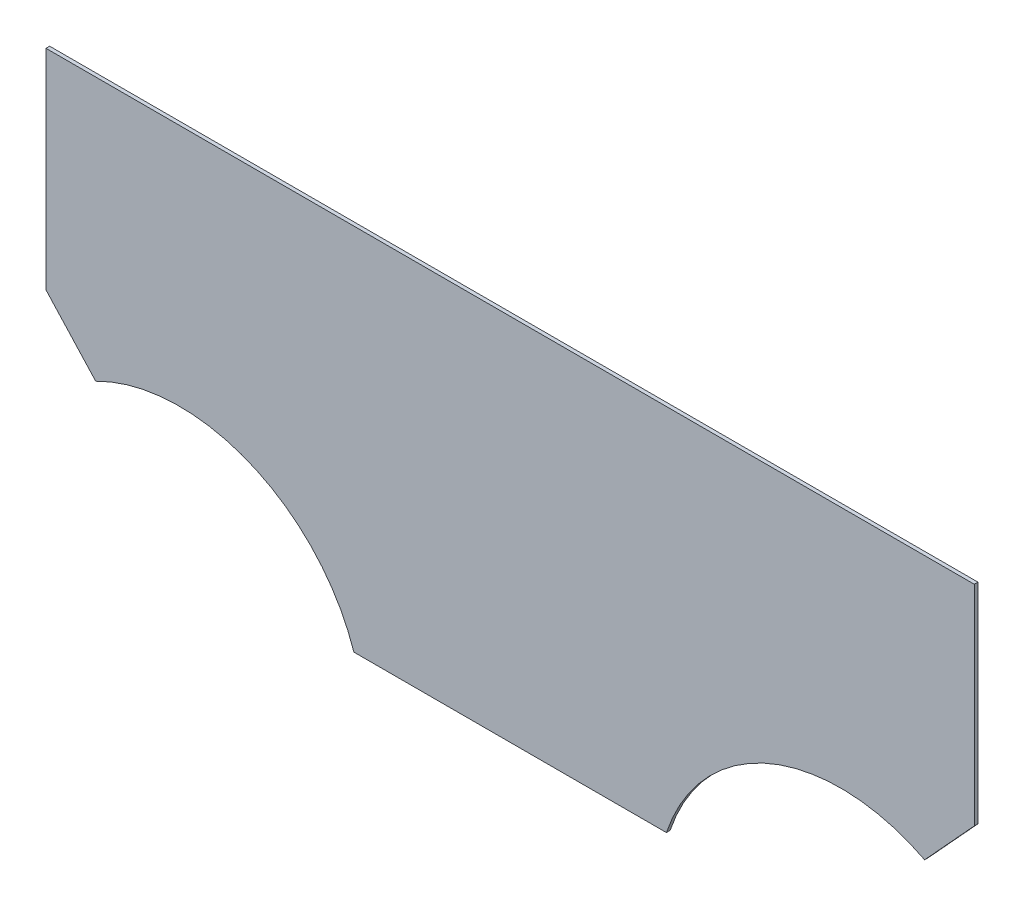
ISO-10303-21;
HEADER;
FILE_DESCRIPTION(('STEP AP214'),'2;1');
FILE_NAME('part.step','',(''),(''),'','','');
FILE_SCHEMA(('AUTOMOTIVE_DESIGN { 1 0 10303 214 1 1 1 1 }'));
ENDSEC;
DATA;
#1=APPLICATION_CONTEXT('core data for automotive mechanical design processes');
#2=APPLICATION_PROTOCOL_DEFINITION('international standard','automotive_design',2000,#1);
#3=PRODUCT_CONTEXT('',#1,'mechanical');
#4=PRODUCT('Part','Part','',(#3));
#5=PRODUCT_RELATED_PRODUCT_CATEGORY('part','',(#4));
#6=PRODUCT_DEFINITION_FORMATION('','',#4);
#7=PRODUCT_DEFINITION_CONTEXT('part definition',#1,'design');
#8=PRODUCT_DEFINITION('design','',#6,#7);
#9=PRODUCT_DEFINITION_SHAPE('','',#8);
#10=(LENGTH_UNIT() NAMED_UNIT(*) SI_UNIT(.MILLI.,.METRE.));
#11=(NAMED_UNIT(*) PLANE_ANGLE_UNIT() SI_UNIT($,.RADIAN.));
#12=(NAMED_UNIT(*) SI_UNIT($,.STERADIAN.) SOLID_ANGLE_UNIT());
#13=UNCERTAINTY_MEASURE_WITH_UNIT(LENGTH_MEASURE(1.E-05),#10,'distance_accuracy_value','');
#14=(GEOMETRIC_REPRESENTATION_CONTEXT(3) GLOBAL_UNCERTAINTY_ASSIGNED_CONTEXT((#13)) GLOBAL_UNIT_ASSIGNED_CONTEXT((#10,
#11,#12)) REPRESENTATION_CONTEXT('',''));
#15=CARTESIAN_POINT('',(0.,0.,0.));
#16=DIRECTION('',(0.,0.,1.));
#17=DIRECTION('',(1.,0.,0.));
#18=AXIS2_PLACEMENT_3D('',#15,#16,#17);
#19=CARTESIAN_POINT('',(72.0080953626778,-182.32146969061,2.));
#20=DIRECTION('',(0.,0.,-1.));
#21=DIRECTION('',(-1.,0.,0.));
#22=AXIS2_PLACEMENT_3D('',#19,#20,#21);
#23=CYLINDRICAL_SURFACE('',#22,100.);
#24=CARTESIAN_POINT('',(72.0080953626778,-182.32146969061,0.));
#25=DIRECTION('',(0.,0.,1.));
#26=DIRECTION('',(1.,0.,0.));
#27=AXIS2_PLACEMENT_3D('',#24,#25,#26);
#28=CIRCLE('',#27,100.);
#29=CARTESIAN_POINT('',(166.886244338372,-150.728165859799,0.));
#30=VERTEX_POINT('',#29);
#31=CARTESIAN_POINT('',(26.4126061623032,-93.3211811260303,0.));
#32=VERTEX_POINT('',#31);
#33=EDGE_CURVE('E133',#30,#32,#28,.T.);
#34=ORIENTED_EDGE('',*,*,#33,.F.);
#35=DIRECTION('',(0.,0.,-1.));
#36=VECTOR('',#35,1.);
#37=CARTESIAN_POINT('',(166.886244338372,-150.728165859799,2.));
#38=LINE('',#37,#36);
#39=CARTESIAN_POINT('',(166.886244338372,-150.728165859799,2.));
#40=VERTEX_POINT('',#39);
#41=EDGE_CURVE('E11',#40,#30,#38,.T.);
#42=ORIENTED_EDGE('',*,*,#41,.F.);
#43=CARTESIAN_POINT('',(72.0080953626778,-182.32146969061,2.));
#44=DIRECTION('',(0.,0.,1.));
#45=DIRECTION('',(1.,0.,0.));
#46=AXIS2_PLACEMENT_3D('',#43,#44,#45);
#47=CIRCLE('',#46,100.);
#48=CARTESIAN_POINT('',(26.4126061623032,-93.3211811260303,2.));
#49=VERTEX_POINT('',#48);
#50=EDGE_CURVE('E153',#40,#49,#47,.T.);
#51=ORIENTED_EDGE('',*,*,#50,.T.);
#52=DIRECTION('',(0.,0.,-1.));
#53=VECTOR('',#52,1.);
#54=CARTESIAN_POINT('',(26.4126061623032,-93.3211811260303,2.));
#55=LINE('',#54,#53);
#56=EDGE_CURVE('E39',#49,#32,#55,.T.);
#57=ORIENTED_EDGE('',*,*,#56,.T.);
#58=EDGE_LOOP('',(#34,#42,#51,#57));
#59=FACE_BOUND('',#58,.T.);
#60=ADVANCED_FACE('F36',(#59),#23,.F.);
#61=CARTESIAN_POINT('',(336.886244338372,-150.728165859799,2.));
#62=DIRECTION('',(0.,-1.,0.));
#63=DIRECTION('',(0.,0.,-1.));
#64=AXIS2_PLACEMENT_3D('',#61,#62,#63);
#65=PLANE('',#64);
#66=DIRECTION('',(-1.,0.,0.));
#67=VECTOR('',#66,1.);
#68=CARTESIAN_POINT('',(336.886244338372,-150.728165859799,0.));
#69=LINE('',#68,#67);
#70=CARTESIAN_POINT('',(336.886244338372,-150.728165859799,0.));
#71=VERTEX_POINT('',#70);
#72=EDGE_CURVE('E151',#71,#30,#69,.T.);
#73=ORIENTED_EDGE('',*,*,#72,.F.);
#74=DIRECTION('',(0.,0.,-1.));
#75=VECTOR('',#74,1.);
#76=CARTESIAN_POINT('',(336.886244338372,-150.728165859799,2.));
#77=LINE('',#76,#75);
#78=CARTESIAN_POINT('',(336.886244338372,-150.728165859799,2.));
#79=VERTEX_POINT('',#78);
#80=EDGE_CURVE('E45',#79,#71,#77,.T.);
#81=ORIENTED_EDGE('',*,*,#80,.F.);
#82=DIRECTION('',(-1.,0.,0.));
#83=VECTOR('',#82,1.);
#84=CARTESIAN_POINT('',(336.886244338372,-150.728165859799,2.));
#85=LINE('',#84,#83);
#86=EDGE_CURVE('E123',#79,#40,#85,.T.);
#87=ORIENTED_EDGE('',*,*,#86,.T.);
#88=ORIENTED_EDGE('',*,*,#41,.T.);
#89=EDGE_LOOP('',(#73,#81,#87,#88));
#90=FACE_BOUND('',#89,.T.);
#91=ADVANCED_FACE('F165',(#90),#65,.T.);
#92=CARTESIAN_POINT('',(431.764393314067,-182.32146969061,2.));
#93=DIRECTION('',(0.,0.,-1.));
#94=DIRECTION('',(-1.,0.,0.));
#95=AXIS2_PLACEMENT_3D('',#92,#93,#94);
#96=CYLINDRICAL_SURFACE('',#95,100.);
#97=CARTESIAN_POINT('',(431.764393314067,-182.32146969061,0.));
#98=DIRECTION('',(0.,0.,1.));
#99=DIRECTION('',(1.,0.,0.));
#100=AXIS2_PLACEMENT_3D('',#97,#98,#99);
#101=CIRCLE('',#100,100.);
#102=CARTESIAN_POINT('',(477.359882514441,-93.3211811260303,0.));
#103=VERTEX_POINT('',#102);
#104=EDGE_CURVE('E110',#103,#71,#101,.T.);
#105=ORIENTED_EDGE('',*,*,#104,.F.);
#106=DIRECTION('',(0.,0.,-1.));
#107=VECTOR('',#106,1.);
#108=CARTESIAN_POINT('',(477.359882514441,-93.3211811260303,2.));
#109=LINE('',#108,#107);
#110=CARTESIAN_POINT('',(477.359882514441,-93.3211811260303,2.));
#111=VERTEX_POINT('',#110);
#112=EDGE_CURVE('E105',#111,#103,#109,.T.);
#113=ORIENTED_EDGE('',*,*,#112,.F.);
#114=CARTESIAN_POINT('',(431.764393314067,-182.32146969061,2.));
#115=DIRECTION('',(0.,0.,1.));
#116=DIRECTION('',(1.,0.,0.));
#117=AXIS2_PLACEMENT_3D('',#114,#115,#116);
#118=CIRCLE('',#117,100.);
#119=EDGE_CURVE('E108',#111,#79,#118,.T.);
#120=ORIENTED_EDGE('',*,*,#119,.T.);
#121=ORIENTED_EDGE('',*,*,#80,.T.);
#122=EDGE_LOOP('',(#105,#113,#120,#121));
#123=FACE_BOUND('',#122,.T.);
#124=ADVANCED_FACE('F107',(#123),#96,.F.);
#125=CARTESIAN_POINT('',(504.386244338372,-63.8326110257021,2.));
#126=DIRECTION('',(0.737214252508203,-0.675659045598274,0.));
#127=DIRECTION('',(0.675659045598274,0.737214252508203,0.));
#128=AXIS2_PLACEMENT_3D('',#125,#126,#127);
#129=PLANE('',#128);
#130=DIRECTION('',(-0.675659045598274,-0.737214252508203,0.));
#131=VECTOR('',#130,1.);
#132=CARTESIAN_POINT('',(504.386244338372,-63.8326110257021,0.));
#133=LINE('',#132,#131);
#134=CARTESIAN_POINT('',(504.386244338372,-63.8326110257021,0.));
#135=VERTEX_POINT('',#134);
#136=EDGE_CURVE('E148',#135,#103,#133,.T.);
#137=ORIENTED_EDGE('',*,*,#136,.F.);
#138=DIRECTION('',(0.,0.,-1.));
#139=VECTOR('',#138,1.);
#140=CARTESIAN_POINT('',(504.386244338372,-63.8326110257021,2.));
#141=LINE('',#140,#139);
#142=CARTESIAN_POINT('',(504.386244338372,-63.8326110257021,2.));
#143=VERTEX_POINT('',#142);
#144=EDGE_CURVE('E115',#143,#135,#141,.T.);
#145=ORIENTED_EDGE('',*,*,#144,.F.);
#146=DIRECTION('',(-0.675659045598274,-0.737214252508203,0.));
#147=VECTOR('',#146,1.);
#148=CARTESIAN_POINT('',(504.386244338372,-63.8326110257021,2.));
#149=LINE('',#148,#147);
#150=EDGE_CURVE('E121',#143,#111,#149,.T.);
#151=ORIENTED_EDGE('',*,*,#150,.T.);
#152=ORIENTED_EDGE('',*,*,#112,.T.);
#153=EDGE_LOOP('',(#137,#145,#151,#152));
#154=FACE_BOUND('',#153,.T.);
#155=ADVANCED_FACE('F125',(#154),#129,.T.);
#156=CARTESIAN_POINT('',(504.386244338372,50.0000000000001,2.));
#157=DIRECTION('',(1.,0.,0.));
#158=DIRECTION('',(0.,0.,-1.));
#159=AXIS2_PLACEMENT_3D('',#156,#157,#158);
#160=PLANE('',#159);
#161=DIRECTION('',(0.,-1.,0.));
#162=VECTOR('',#161,1.);
#163=CARTESIAN_POINT('',(504.386244338372,50.0000000000001,0.));
#164=LINE('',#163,#162);
#165=CARTESIAN_POINT('',(504.386244338372,50.0000000000001,0.));
#166=VERTEX_POINT('',#165);
#167=EDGE_CURVE('E145',#166,#135,#164,.T.);
#168=ORIENTED_EDGE('',*,*,#167,.F.);
#169=DIRECTION('',(0.,0.,-1.));
#170=VECTOR('',#169,1.);
#171=CARTESIAN_POINT('',(504.386244338372,50.0000000000001,2.));
#172=LINE('',#171,#170);
#173=CARTESIAN_POINT('',(504.386244338372,50.0000000000001,2.));
#174=VERTEX_POINT('',#173);
#175=EDGE_CURVE('E157',#174,#166,#172,.T.);
#176=ORIENTED_EDGE('',*,*,#175,.F.);
#177=DIRECTION('',(0.,-1.,0.));
#178=VECTOR('',#177,1.);
#179=CARTESIAN_POINT('',(504.386244338372,50.0000000000001,2.));
#180=LINE('',#179,#178);
#181=EDGE_CURVE('E126',#174,#143,#180,.T.);
#182=ORIENTED_EDGE('',*,*,#181,.T.);
#183=ORIENTED_EDGE('',*,*,#144,.T.);
#184=EDGE_LOOP('',(#168,#176,#182,#183));
#185=FACE_BOUND('',#184,.T.);
#186=ADVANCED_FACE('F178',(#185),#160,.T.);
#187=CARTESIAN_POINT('',(-0.613755661627802,50.0000000000001,2.));
#188=DIRECTION('',(0.,1.,0.));
#189=DIRECTION('',(-1.,0.,0.));
#190=AXIS2_PLACEMENT_3D('',#187,#188,#189);
#191=PLANE('',#190);
#192=DIRECTION('',(1.,0.,0.));
#193=VECTOR('',#192,1.);
#194=CARTESIAN_POINT('',(-0.613755661627802,50.0000000000001,0.));
#195=LINE('',#194,#193);
#196=CARTESIAN_POINT('',(-0.613755661627802,50.0000000000001,0.));
#197=VERTEX_POINT('',#196);
#198=EDGE_CURVE('E142',#197,#166,#195,.T.);
#199=ORIENTED_EDGE('',*,*,#198,.F.);
#200=DIRECTION('',(0.,0.,-1.));
#201=VECTOR('',#200,1.);
#202=CARTESIAN_POINT('',(-0.613755661627802,50.0000000000001,2.));
#203=LINE('',#202,#201);
#204=CARTESIAN_POINT('',(-0.613755661627802,50.0000000000001,2.));
#205=VERTEX_POINT('',#204);
#206=EDGE_CURVE('E159',#205,#197,#203,.T.);
#207=ORIENTED_EDGE('',*,*,#206,.F.);
#208=DIRECTION('',(1.,0.,0.));
#209=VECTOR('',#208,1.);
#210=CARTESIAN_POINT('',(-0.613755661627802,50.0000000000001,2.));
#211=LINE('',#210,#209);
#212=EDGE_CURVE('E128',#205,#174,#211,.T.);
#213=ORIENTED_EDGE('',*,*,#212,.T.);
#214=ORIENTED_EDGE('',*,*,#175,.T.);
#215=EDGE_LOOP('',(#199,#207,#213,#214));
#216=FACE_BOUND('',#215,.T.);
#217=ADVANCED_FACE('F181',(#216),#191,.T.);
#218=CARTESIAN_POINT('',(-0.613755661627802,-63.8326110257022,2.));
#219=DIRECTION('',(-1.,0.,0.));
#220=DIRECTION('',(0.,0.,1.));
#221=AXIS2_PLACEMENT_3D('',#218,#219,#220);
#222=PLANE('',#221);
#223=DIRECTION('',(0.,1.,0.));
#224=VECTOR('',#223,1.);
#225=CARTESIAN_POINT('',(-0.613755661627802,-63.8326110257022,0.));
#226=LINE('',#225,#224);
#227=CARTESIAN_POINT('',(-0.613755661627802,-63.8326110257022,0.));
#228=VERTEX_POINT('',#227);
#229=EDGE_CURVE('E139',#228,#197,#226,.T.);
#230=ORIENTED_EDGE('',*,*,#229,.F.);
#231=DIRECTION('',(0.,0.,-1.));
#232=VECTOR('',#231,1.);
#233=CARTESIAN_POINT('',(-0.613755661627802,-63.8326110257022,2.));
#234=LINE('',#233,#232);
#235=CARTESIAN_POINT('',(-0.613755661627802,-63.8326110257022,2.));
#236=VERTEX_POINT('',#235);
#237=EDGE_CURVE('E160',#236,#228,#234,.T.);
#238=ORIENTED_EDGE('',*,*,#237,.F.);
#239=DIRECTION('',(0.,1.,0.));
#240=VECTOR('',#239,1.);
#241=CARTESIAN_POINT('',(-0.613755661627802,-63.8326110257022,2.));
#242=LINE('',#241,#240);
#243=EDGE_CURVE('E256',#236,#205,#242,.T.);
#244=ORIENTED_EDGE('',*,*,#243,.T.);
#245=ORIENTED_EDGE('',*,*,#206,.T.);
#246=EDGE_LOOP('',(#230,#238,#244,#245));
#247=FACE_BOUND('',#246,.T.);
#248=ADVANCED_FACE('F185',(#247),#222,.T.);
#249=CARTESIAN_POINT('',(26.4126061623032,-93.3211811260303,2.));
#250=DIRECTION('',(-0.737214252508204,-0.675659045598274,0.));
#251=DIRECTION('',(0.675659045598274,-0.737214252508204,0.));
#252=AXIS2_PLACEMENT_3D('',#249,#250,#251);
#253=PLANE('',#252);
#254=DIRECTION('',(-0.675659045598274,0.737214252508204,0.));
#255=VECTOR('',#254,1.);
#256=CARTESIAN_POINT('',(26.4126061623032,-93.3211811260303,0.));
#257=LINE('',#256,#255);
#258=EDGE_CURVE('E136',#32,#228,#257,.T.);
#259=ORIENTED_EDGE('',*,*,#258,.F.);
#260=ORIENTED_EDGE('',*,*,#56,.F.);
#261=DIRECTION('',(-0.675659045598274,0.737214252508204,0.));
#262=VECTOR('',#261,1.);
#263=CARTESIAN_POINT('',(26.4126061623032,-93.3211811260303,2.));
#264=LINE('',#263,#262);
#265=EDGE_CURVE('E257',#49,#236,#264,.T.);
#266=ORIENTED_EDGE('',*,*,#265,.T.);
#267=ORIENTED_EDGE('',*,*,#237,.T.);
#268=EDGE_LOOP('',(#259,#260,#266,#267));
#269=FACE_BOUND('',#268,.T.);
#270=ADVANCED_FACE('F162',(#269),#253,.T.);
#271=CARTESIAN_POINT('',(72.0080953626778,-182.32146969061,2.));
#272=DIRECTION('',(0.,0.,1.));
#273=DIRECTION('',(1.,0.,0.));
#274=AXIS2_PLACEMENT_3D('',#271,#272,#273);
#275=PLANE('',#274);
#276=ORIENTED_EDGE('',*,*,#50,.F.);
#277=ORIENTED_EDGE('',*,*,#86,.F.);
#278=ORIENTED_EDGE('',*,*,#119,.F.);
#279=ORIENTED_EDGE('',*,*,#150,.F.);
#280=ORIENTED_EDGE('',*,*,#181,.F.);
#281=ORIENTED_EDGE('',*,*,#212,.F.);
#282=ORIENTED_EDGE('',*,*,#243,.F.);
#283=ORIENTED_EDGE('',*,*,#265,.F.);
#284=EDGE_LOOP('',(#276,#277,#278,#279,#280,#281,#282,#283));
#285=FACE_BOUND('',#284,.T.);
#286=ADVANCED_FACE('F119',(#285),#275,.T.);
#287=CARTESIAN_POINT('',(72.0080953626778,-182.32146969061,0.));
#288=DIRECTION('',(0.,0.,1.));
#289=DIRECTION('',(1.,0.,0.));
#290=AXIS2_PLACEMENT_3D('',#287,#288,#289);
#291=PLANE('',#290);
#292=ORIENTED_EDGE('',*,*,#33,.T.);
#293=ORIENTED_EDGE('',*,*,#258,.T.);
#294=ORIENTED_EDGE('',*,*,#229,.T.);
#295=ORIENTED_EDGE('',*,*,#198,.T.);
#296=ORIENTED_EDGE('',*,*,#167,.T.);
#297=ORIENTED_EDGE('',*,*,#136,.T.);
#298=ORIENTED_EDGE('',*,*,#104,.T.);
#299=ORIENTED_EDGE('',*,*,#72,.T.);
#300=EDGE_LOOP('',(#292,#293,#294,#295,#296,#297,#298,#299));
#301=FACE_BOUND('',#300,.T.);
#302=ADVANCED_FACE('F164',(#301),#291,.F.);
#303=CLOSED_SHELL('',(#60,#91,#124,#155,#186,#217,#248,#270,#286,#302));
#304=MANIFOLD_SOLID_BREP('B2',#303);
#305=ADVANCED_BREP_SHAPE_REPRESENTATION('',(#18,#304),#14);
#306=SHAPE_DEFINITION_REPRESENTATION(#9,#305);
ENDSEC;
END-ISO-10303-21;
